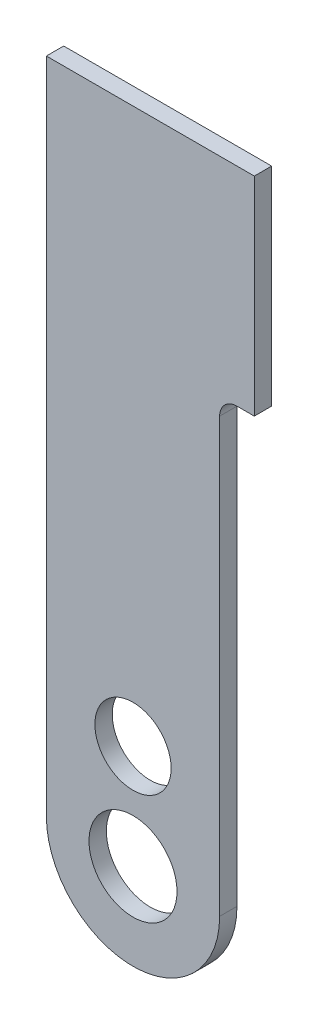
ISO-10303-21;
HEADER;
FILE_DESCRIPTION(('STEP AP214'),'2;1');
FILE_NAME('part.step','',(''),(''),'','','');
FILE_SCHEMA(('AUTOMOTIVE_DESIGN { 1 0 10303 214 1 1 1 1 }'));
ENDSEC;
DATA;
#1=APPLICATION_CONTEXT('core data for automotive mechanical design processes');
#2=APPLICATION_PROTOCOL_DEFINITION('international standard','automotive_design',2000,#1);
#3=PRODUCT_CONTEXT('',#1,'mechanical');
#4=PRODUCT('Part','Part','',(#3));
#5=PRODUCT_RELATED_PRODUCT_CATEGORY('part','',(#4));
#6=PRODUCT_DEFINITION_FORMATION('','',#4);
#7=PRODUCT_DEFINITION_CONTEXT('part definition',#1,'design');
#8=PRODUCT_DEFINITION('design','',#6,#7);
#9=PRODUCT_DEFINITION_SHAPE('','',#8);
#10=(LENGTH_UNIT() NAMED_UNIT(*) SI_UNIT(.MILLI.,.METRE.));
#11=(NAMED_UNIT(*) PLANE_ANGLE_UNIT() SI_UNIT($,.RADIAN.));
#12=(NAMED_UNIT(*) SI_UNIT($,.STERADIAN.) SOLID_ANGLE_UNIT());
#13=UNCERTAINTY_MEASURE_WITH_UNIT(LENGTH_MEASURE(1.E-05),#10,'distance_accuracy_value','');
#14=(GEOMETRIC_REPRESENTATION_CONTEXT(3) GLOBAL_UNCERTAINTY_ASSIGNED_CONTEXT((#13)) GLOBAL_UNIT_ASSIGNED_CONTEXT((#10,
#11,#12)) REPRESENTATION_CONTEXT('',''));
#15=CARTESIAN_POINT('',(0.,0.,0.));
#16=DIRECTION('',(0.,0.,1.));
#17=DIRECTION('',(1.,0.,0.));
#18=AXIS2_PLACEMENT_3D('',#15,#16,#17);
#19=CARTESIAN_POINT('',(25.,-30.,2.5));
#20=DIRECTION('',(-1.,0.,0.));
#21=DIRECTION('',(0.,0.,1.));
#22=AXIS2_PLACEMENT_3D('',#19,#20,#21);
#23=PLANE('',#22);
#24=DIRECTION('',(0.,1.,0.));
#25=VECTOR('',#24,1.);
#26=CARTESIAN_POINT('',(25.,-30.,-2.5));
#27=LINE('',#26,#25);
#28=CARTESIAN_POINT('',(25.,-30.,-2.5));
#29=VERTEX_POINT('',#28);
#30=CARTESIAN_POINT('',(25.,95.,-2.5));
#31=VERTEX_POINT('',#30);
#32=EDGE_CURVE('E160',#29,#31,#27,.T.);
#33=ORIENTED_EDGE('',*,*,#32,.T.);
#34=DIRECTION('',(0.,0.,-1.));
#35=VECTOR('',#34,1.);
#36=CARTESIAN_POINT('',(25.,95.,2.5));
#37=LINE('',#36,#35);
#38=CARTESIAN_POINT('',(25.,95.,2.5));
#39=VERTEX_POINT('',#38);
#40=EDGE_CURVE('E69',#31,#39,#37,.F.);
#41=ORIENTED_EDGE('',*,*,#40,.T.);
#42=DIRECTION('',(0.,1.,0.));
#43=VECTOR('',#42,1.);
#44=CARTESIAN_POINT('',(25.,-30.,2.5));
#45=LINE('',#44,#43);
#46=CARTESIAN_POINT('',(25.,-30.,2.5));
#47=VERTEX_POINT('',#46);
#48=EDGE_CURVE('E149',#47,#39,#45,.T.);
#49=ORIENTED_EDGE('',*,*,#48,.F.);
#50=DIRECTION('',(0.,0.,-1.));
#51=VECTOR('',#50,1.);
#52=CARTESIAN_POINT('',(25.,-30.,2.5));
#53=LINE('',#52,#51);
#54=EDGE_CURVE('E168',#47,#29,#53,.T.);
#55=ORIENTED_EDGE('',*,*,#54,.T.);
#56=EDGE_LOOP('',(#33,#41,#49,#55));
#57=FACE_BOUND('',#56,.T.);
#58=ADVANCED_FACE('F47',(#57),#23,.F.);
#59=CARTESIAN_POINT('',(0.,-30.,2.5));
#60=DIRECTION('',(0.,0.,-1.));
#61=DIRECTION('',(-1.,0.,0.));
#62=AXIS2_PLACEMENT_3D('',#59,#60,#61);
#63=CYLINDRICAL_SURFACE('',#62,25.);
#64=DIRECTION('',(0.,0.,-1.));
#65=VECTOR('',#64,1.);
#66=CARTESIAN_POINT('',(-25.,-30.,2.5));
#67=LINE('',#66,#65);
#68=CARTESIAN_POINT('',(-25.,-30.,2.5));
#69=VERTEX_POINT('',#68);
#70=CARTESIAN_POINT('',(-25.,-30.,-2.5));
#71=VERTEX_POINT('',#70);
#72=EDGE_CURVE('E172',#69,#71,#67,.T.);
#73=ORIENTED_EDGE('',*,*,#72,.T.);
#74=CARTESIAN_POINT('',(0.,-30.,-2.5));
#75=DIRECTION('',(0.,0.,1.));
#76=DIRECTION('',(1.,0.,0.));
#77=AXIS2_PLACEMENT_3D('',#74,#75,#76);
#78=CIRCLE('',#77,25.);
#79=EDGE_CURVE('E176',#71,#29,#78,.T.);
#80=ORIENTED_EDGE('',*,*,#79,.T.);
#81=ORIENTED_EDGE('',*,*,#54,.F.);
#82=CARTESIAN_POINT('',(0.,-30.,2.5));
#83=DIRECTION('',(0.,0.,1.));
#84=DIRECTION('',(1.,0.,0.));
#85=AXIS2_PLACEMENT_3D('',#82,#83,#84);
#86=CIRCLE('',#85,25.);
#87=EDGE_CURVE('E177',#69,#47,#86,.T.);
#88=ORIENTED_EDGE('',*,*,#87,.F.);
#89=EDGE_LOOP('',(#73,#80,#81,#88));
#90=FACE_BOUND('',#89,.T.);
#91=ADVANCED_FACE('F198',(#90),#63,.T.);
#92=CARTESIAN_POINT('',(0.,-30.,2.5));
#93=DIRECTION('',(0.,0.,1.));
#94=DIRECTION('',(1.,0.,0.));
#95=AXIS2_PLACEMENT_3D('',#92,#93,#94);
#96=PLANE('',#95);
#97=CARTESIAN_POINT('',(0.,0.,2.5));
#98=DIRECTION('',(0.,0.,1.));
#99=DIRECTION('',(1.,0.,0.));
#100=AXIS2_PLACEMENT_3D('',#97,#98,#99);
#101=CIRCLE('',#100,11.);
#102=CARTESIAN_POINT('',(11.,0.,2.5));
#103=VERTEX_POINT('',#102);
#104=EDGE_CURVE('E237',#103,#103,#101,.T.);
#105=ORIENTED_EDGE('',*,*,#104,.F.);
#106=EDGE_LOOP('',(#105));
#107=FACE_BOUND('',#106,.T.);
#108=CARTESIAN_POINT('',(0.,-30.,2.5));
#109=DIRECTION('',(0.,0.,1.));
#110=DIRECTION('',(1.,0.,0.));
#111=AXIS2_PLACEMENT_3D('',#108,#109,#110);
#112=CIRCLE('',#111,12.7);
#113=CARTESIAN_POINT('',(12.7,-30.,2.5));
#114=VERTEX_POINT('',#113);
#115=EDGE_CURVE('E233',#114,#114,#112,.T.);
#116=ORIENTED_EDGE('',*,*,#115,.F.);
#117=EDGE_LOOP('',(#116));
#118=FACE_BOUND('',#117,.T.);
#119=ORIENTED_EDGE('',*,*,#87,.T.);
#120=ORIENTED_EDGE('',*,*,#48,.T.);
#121=CARTESIAN_POINT('',(30.,95.,2.5));
#122=DIRECTION('',(0.,0.,1.));
#123=DIRECTION('',(1.,0.,0.));
#124=AXIS2_PLACEMENT_3D('',#121,#122,#123);
#125=CIRCLE('',#124,5.);
#126=CARTESIAN_POINT('',(30.,100.,2.5));
#127=VERTEX_POINT('',#126);
#128=EDGE_CURVE('E11',#39,#127,#125,.F.);
#129=ORIENTED_EDGE('',*,*,#128,.T.);
#130=DIRECTION('',(1.,0.,0.));
#131=VECTOR('',#130,1.);
#132=CARTESIAN_POINT('',(25.,100.,2.5));
#133=LINE('',#132,#131);
#134=CARTESIAN_POINT('',(35.,100.,2.5));
#135=VERTEX_POINT('',#134);
#136=EDGE_CURVE('E107',#127,#135,#133,.T.);
#137=ORIENTED_EDGE('',*,*,#136,.T.);
#138=DIRECTION('',(0.,1.,0.));
#139=VECTOR('',#138,1.);
#140=CARTESIAN_POINT('',(35.,160.,2.5));
#141=LINE('',#140,#139);
#142=CARTESIAN_POINT('',(35.,160.,2.5));
#143=VERTEX_POINT('',#142);
#144=EDGE_CURVE('E112',#135,#143,#141,.T.);
#145=ORIENTED_EDGE('',*,*,#144,.T.);
#146=DIRECTION('',(-1.,0.,0.));
#147=VECTOR('',#146,1.);
#148=CARTESIAN_POINT('',(-25.,160.,2.5));
#149=LINE('',#148,#147);
#150=CARTESIAN_POINT('',(-25.,160.,2.5));
#151=VERTEX_POINT('',#150);
#152=EDGE_CURVE('E153',#143,#151,#149,.T.);
#153=ORIENTED_EDGE('',*,*,#152,.T.);
#154=DIRECTION('',(0.,-1.,0.));
#155=VECTOR('',#154,1.);
#156=CARTESIAN_POINT('',(-25.,-30.,2.5));
#157=LINE('',#156,#155);
#158=EDGE_CURVE('E145',#151,#69,#157,.T.);
#159=ORIENTED_EDGE('',*,*,#158,.T.);
#160=EDGE_LOOP('',(#119,#120,#129,#137,#145,#153,#159));
#161=FACE_BOUND('',#160,.T.);
#162=ADVANCED_FACE('F110',(#107,#118,#161),#96,.T.);
#163=CARTESIAN_POINT('',(0.,-30.,-2.5));
#164=DIRECTION('',(0.,0.,1.));
#165=DIRECTION('',(1.,0.,0.));
#166=AXIS2_PLACEMENT_3D('',#163,#164,#165);
#167=PLANE('',#166);
#168=CARTESIAN_POINT('',(0.,0.,-2.5));
#169=DIRECTION('',(0.,0.,1.));
#170=DIRECTION('',(1.,0.,0.));
#171=AXIS2_PLACEMENT_3D('',#168,#169,#170);
#172=CIRCLE('',#171,11.);
#173=CARTESIAN_POINT('',(11.,0.,-2.5));
#174=VERTEX_POINT('',#173);
#175=EDGE_CURVE('E142',#174,#174,#172,.T.);
#176=ORIENTED_EDGE('',*,*,#175,.T.);
#177=EDGE_LOOP('',(#176));
#178=FACE_BOUND('',#177,.T.);
#179=CARTESIAN_POINT('',(0.,-30.,-2.5));
#180=DIRECTION('',(0.,0.,1.));
#181=DIRECTION('',(1.,0.,0.));
#182=AXIS2_PLACEMENT_3D('',#179,#180,#181);
#183=CIRCLE('',#182,12.7);
#184=CARTESIAN_POINT('',(12.7,-30.,-2.5));
#185=VERTEX_POINT('',#184);
#186=EDGE_CURVE('E230',#185,#185,#183,.T.);
#187=ORIENTED_EDGE('',*,*,#186,.T.);
#188=EDGE_LOOP('',(#187));
#189=FACE_BOUND('',#188,.T.);
#190=ORIENTED_EDGE('',*,*,#79,.F.);
#191=DIRECTION('',(0.,-1.,0.));
#192=VECTOR('',#191,1.);
#193=CARTESIAN_POINT('',(-25.,-30.,-2.5));
#194=LINE('',#193,#192);
#195=CARTESIAN_POINT('',(-25.,160.,-2.5));
#196=VERTEX_POINT('',#195);
#197=EDGE_CURVE('E129',#196,#71,#194,.T.);
#198=ORIENTED_EDGE('',*,*,#197,.F.);
#199=DIRECTION('',(-1.,0.,0.));
#200=VECTOR('',#199,1.);
#201=CARTESIAN_POINT('',(-25.,160.,-2.5));
#202=LINE('',#201,#200);
#203=CARTESIAN_POINT('',(35.,160.,-2.5));
#204=VERTEX_POINT('',#203);
#205=EDGE_CURVE('E150',#204,#196,#202,.T.);
#206=ORIENTED_EDGE('',*,*,#205,.F.);
#207=DIRECTION('',(0.,1.,0.));
#208=VECTOR('',#207,1.);
#209=CARTESIAN_POINT('',(35.,160.,-2.5));
#210=LINE('',#209,#208);
#211=CARTESIAN_POINT('',(35.,100.,-2.5));
#212=VERTEX_POINT('',#211);
#213=EDGE_CURVE('E119',#212,#204,#210,.T.);
#214=ORIENTED_EDGE('',*,*,#213,.F.);
#215=DIRECTION('',(1.,0.,0.));
#216=VECTOR('',#215,1.);
#217=CARTESIAN_POINT('',(25.,100.,-2.5));
#218=LINE('',#217,#216);
#219=CARTESIAN_POINT('',(30.,100.,-2.5));
#220=VERTEX_POINT('',#219);
#221=EDGE_CURVE('E124',#220,#212,#218,.T.);
#222=ORIENTED_EDGE('',*,*,#221,.F.);
#223=CARTESIAN_POINT('',(30.,95.,-2.5));
#224=DIRECTION('',(0.,0.,1.));
#225=DIRECTION('',(1.,0.,0.));
#226=AXIS2_PLACEMENT_3D('',#223,#224,#225);
#227=CIRCLE('',#226,5.);
#228=EDGE_CURVE('E56',#220,#31,#227,.T.);
#229=ORIENTED_EDGE('',*,*,#228,.T.);
#230=ORIENTED_EDGE('',*,*,#32,.F.);
#231=EDGE_LOOP('',(#190,#198,#206,#214,#222,#229,#230));
#232=FACE_BOUND('',#231,.T.);
#233=ADVANCED_FACE('F188',(#178,#189,#232),#167,.F.);
#234=CARTESIAN_POINT('',(-25.,-30.,2.5));
#235=DIRECTION('',(1.,0.,0.));
#236=DIRECTION('',(0.,0.,-1.));
#237=AXIS2_PLACEMENT_3D('',#234,#235,#236);
#238=PLANE('',#237);
#239=ORIENTED_EDGE('',*,*,#197,.T.);
#240=ORIENTED_EDGE('',*,*,#72,.F.);
#241=ORIENTED_EDGE('',*,*,#158,.F.);
#242=DIRECTION('',(0.,0.,-1.));
#243=VECTOR('',#242,1.);
#244=CARTESIAN_POINT('',(-25.,160.,2.5));
#245=LINE('',#244,#243);
#246=EDGE_CURVE('E156',#151,#196,#245,.T.);
#247=ORIENTED_EDGE('',*,*,#246,.T.);
#248=EDGE_LOOP('',(#239,#240,#241,#247));
#249=FACE_BOUND('',#248,.T.);
#250=ADVANCED_FACE('F196',(#249),#238,.F.);
#251=CARTESIAN_POINT('',(-25.,160.,2.5));
#252=DIRECTION('',(0.,-1.,0.));
#253=DIRECTION('',(0.,0.,-1.));
#254=AXIS2_PLACEMENT_3D('',#251,#252,#253);
#255=PLANE('',#254);
#256=ORIENTED_EDGE('',*,*,#205,.T.);
#257=ORIENTED_EDGE('',*,*,#246,.F.);
#258=ORIENTED_EDGE('',*,*,#152,.F.);
#259=DIRECTION('',(0.,0.,-1.));
#260=VECTOR('',#259,1.);
#261=CARTESIAN_POINT('',(35.,160.,2.5));
#262=LINE('',#261,#260);
#263=EDGE_CURVE('E130',#143,#204,#262,.T.);
#264=ORIENTED_EDGE('',*,*,#263,.T.);
#265=EDGE_LOOP('',(#256,#257,#258,#264));
#266=FACE_BOUND('',#265,.T.);
#267=ADVANCED_FACE('F191',(#266),#255,.F.);
#268=CARTESIAN_POINT('',(25.,100.,2.5));
#269=DIRECTION('',(0.,1.,0.));
#270=DIRECTION('',(0.,0.,1.));
#271=AXIS2_PLACEMENT_3D('',#268,#269,#270);
#272=PLANE('',#271);
#273=ORIENTED_EDGE('',*,*,#136,.F.);
#274=DIRECTION('',(0.,0.,-1.));
#275=VECTOR('',#274,1.);
#276=CARTESIAN_POINT('',(30.,100.,-2.5));
#277=LINE('',#276,#275);
#278=EDGE_CURVE('E180',#127,#220,#277,.T.);
#279=ORIENTED_EDGE('',*,*,#278,.T.);
#280=ORIENTED_EDGE('',*,*,#221,.T.);
#281=DIRECTION('',(0.,0.,-1.));
#282=VECTOR('',#281,1.);
#283=CARTESIAN_POINT('',(35.,100.,2.5));
#284=LINE('',#283,#282);
#285=EDGE_CURVE('E122',#135,#212,#284,.T.);
#286=ORIENTED_EDGE('',*,*,#285,.F.);
#287=EDGE_LOOP('',(#273,#279,#280,#286));
#288=FACE_BOUND('',#287,.T.);
#289=ADVANCED_FACE('F123',(#288),#272,.F.);
#290=CARTESIAN_POINT('',(35.,160.,2.5));
#291=DIRECTION('',(-1.,0.,0.));
#292=DIRECTION('',(0.,-1.,0.));
#293=AXIS2_PLACEMENT_3D('',#290,#291,#292);
#294=PLANE('',#293);
#295=ORIENTED_EDGE('',*,*,#213,.T.);
#296=ORIENTED_EDGE('',*,*,#263,.F.);
#297=ORIENTED_EDGE('',*,*,#144,.F.);
#298=ORIENTED_EDGE('',*,*,#285,.T.);
#299=EDGE_LOOP('',(#295,#296,#297,#298));
#300=FACE_BOUND('',#299,.T.);
#301=ADVANCED_FACE('F132',(#300),#294,.F.);
#302=CARTESIAN_POINT('',(0.,-30.,-2.5));
#303=DIRECTION('',(0.,0.,1.));
#304=DIRECTION('',(1.,0.,0.));
#305=AXIS2_PLACEMENT_3D('',#302,#303,#304);
#306=CYLINDRICAL_SURFACE('',#305,12.7);
#307=ORIENTED_EDGE('',*,*,#186,.F.);
#308=EDGE_LOOP('',(#307));
#309=FACE_BOUND('',#308,.T.);
#310=ORIENTED_EDGE('',*,*,#115,.T.);
#311=EDGE_LOOP('',(#310));
#312=FACE_BOUND('',#311,.T.);
#313=ADVANCED_FACE('F205',(#309,#312),#306,.F.);
#314=CARTESIAN_POINT('',(0.,0.,-2.5));
#315=DIRECTION('',(0.,0.,1.));
#316=DIRECTION('',(1.,0.,0.));
#317=AXIS2_PLACEMENT_3D('',#314,#315,#316);
#318=CYLINDRICAL_SURFACE('',#317,11.);
#319=ORIENTED_EDGE('',*,*,#175,.F.);
#320=EDGE_LOOP('',(#319));
#321=FACE_BOUND('',#320,.T.);
#322=ORIENTED_EDGE('',*,*,#104,.T.);
#323=EDGE_LOOP('',(#322));
#324=FACE_BOUND('',#323,.T.);
#325=ADVANCED_FACE('F200',(#321,#324),#318,.F.);
#326=CARTESIAN_POINT('',(30.,95.,2.5));
#327=DIRECTION('',(0.,0.,1.));
#328=DIRECTION('',(1.,0.,0.));
#329=AXIS2_PLACEMENT_3D('',#326,#327,#328);
#330=CYLINDRICAL_SURFACE('',#329,5.);
#331=ORIENTED_EDGE('',*,*,#128,.F.);
#332=ORIENTED_EDGE('',*,*,#40,.F.);
#333=ORIENTED_EDGE('',*,*,#228,.F.);
#334=ORIENTED_EDGE('',*,*,#278,.F.);
#335=EDGE_LOOP('',(#331,#332,#333,#334));
#336=FACE_BOUND('',#335,.T.);
#337=ADVANCED_FACE('F49',(#336),#330,.F.);
#338=CLOSED_SHELL('',(#58,#91,#162,#233,#250,#267,#289,#301,#313,#325,#337));
#339=MANIFOLD_SOLID_BREP('B2',#338);
#340=ADVANCED_BREP_SHAPE_REPRESENTATION('',(#18,#339),#14);
#341=SHAPE_DEFINITION_REPRESENTATION(#9,#340);
ENDSEC;
END-ISO-10303-21;
